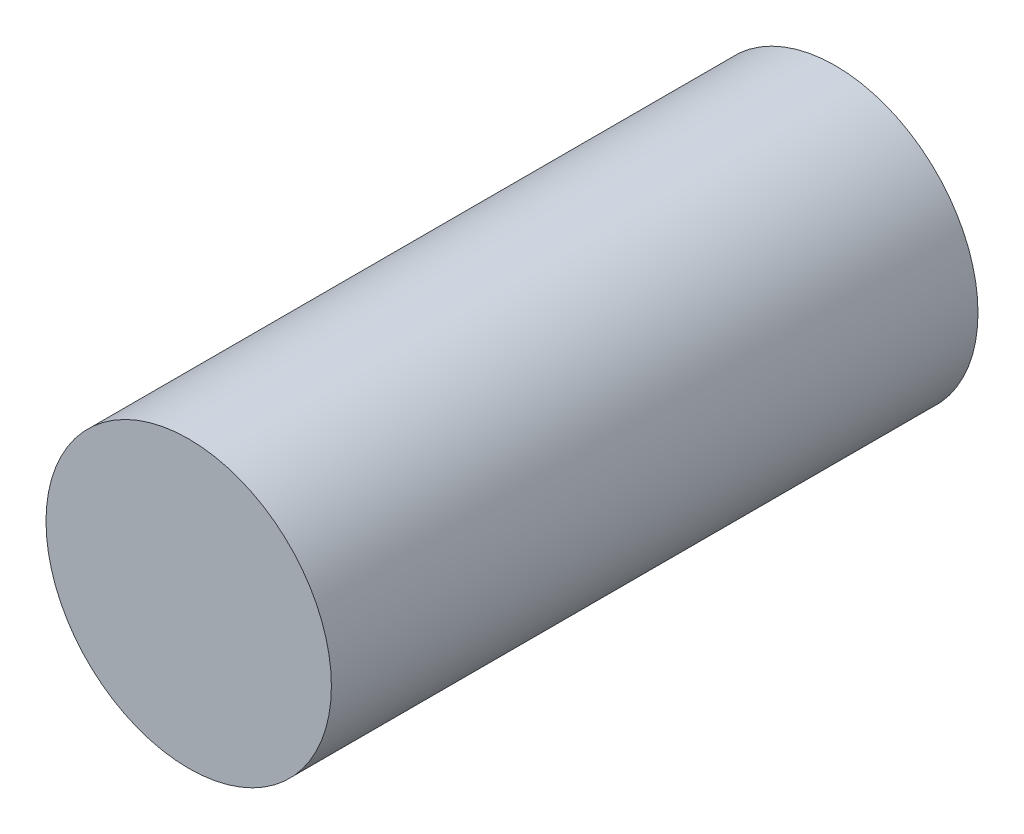
ISO-10303-21;
HEADER;
FILE_DESCRIPTION(('STEP AP214'),'2;1');
FILE_NAME('part.step','',(''),(''),'','','');
FILE_SCHEMA(('AUTOMOTIVE_DESIGN { 1 0 10303 214 1 1 1 1 }'));
ENDSEC;
DATA;
#1=APPLICATION_CONTEXT('core data for automotive mechanical design processes');
#2=APPLICATION_PROTOCOL_DEFINITION('international standard','automotive_design',2000,#1);
#3=PRODUCT_CONTEXT('',#1,'mechanical');
#4=PRODUCT('Part','Part','',(#3));
#5=PRODUCT_RELATED_PRODUCT_CATEGORY('part','',(#4));
#6=PRODUCT_DEFINITION_FORMATION('','',#4);
#7=PRODUCT_DEFINITION_CONTEXT('part definition',#1,'design');
#8=PRODUCT_DEFINITION('design','',#6,#7);
#9=PRODUCT_DEFINITION_SHAPE('','',#8);
#10=(LENGTH_UNIT() NAMED_UNIT(*) SI_UNIT(.MILLI.,.METRE.));
#11=(NAMED_UNIT(*) PLANE_ANGLE_UNIT() SI_UNIT($,.RADIAN.));
#12=(NAMED_UNIT(*) SI_UNIT($,.STERADIAN.) SOLID_ANGLE_UNIT());
#13=UNCERTAINTY_MEASURE_WITH_UNIT(LENGTH_MEASURE(1.E-05),#10,'distance_accuracy_value','');
#14=(GEOMETRIC_REPRESENTATION_CONTEXT(3) GLOBAL_UNCERTAINTY_ASSIGNED_CONTEXT((#13)) GLOBAL_UNIT_ASSIGNED_CONTEXT((#10,
#11,#12)) REPRESENTATION_CONTEXT('',''));
#15=CARTESIAN_POINT('',(0.,0.,0.));
#16=DIRECTION('',(0.,0.,1.));
#17=DIRECTION('',(1.,0.,0.));
#18=AXIS2_PLACEMENT_3D('',#15,#16,#17);
#19=CARTESIAN_POINT('',(0.,0.,21.75));
#20=DIRECTION('',(0.,0.,-1.));
#21=DIRECTION('',(-1.,0.,0.));
#22=AXIS2_PLACEMENT_3D('',#19,#20,#21);
#23=CYLINDRICAL_SURFACE('',#22,6.4);
#24=CARTESIAN_POINT('',(0.,0.,21.75));
#25=DIRECTION('',(0.,0.,1.));
#26=DIRECTION('',(1.,0.,0.));
#27=AXIS2_PLACEMENT_3D('',#24,#25,#26);
#28=CIRCLE('',#27,6.4);
#29=CARTESIAN_POINT('',(-6.4,0.,21.75));
#30=VERTEX_POINT('',#29);
#31=EDGE_CURVE('E10',#30,#30,#28,.T.);
#32=CARTESIAN_POINT('',(0.,0.,-7.25));
#33=DIRECTION('',(0.,0.,1.));
#34=DIRECTION('',(1.,0.,0.));
#35=AXIS2_PLACEMENT_3D('',#32,#33,#34);
#36=CIRCLE('',#35,6.4);
#37=CARTESIAN_POINT('',(-6.4,0.,-7.25));
#38=VERTEX_POINT('',#37);
#39=EDGE_CURVE('E36',#38,#38,#36,.T.);
#40=CARTESIAN_POINT('',(-6.4,0.,21.75));
#41=CARTESIAN_POINT('',(-6.4,0.,21.4479166666667));
#42=CARTESIAN_POINT('',(-6.4,0.,21.1458333333333));
#43=CARTESIAN_POINT('',(-6.4,0.,20.5416666666667));
#44=CARTESIAN_POINT('',(-6.4,0.,20.2395833333333));
#45=CARTESIAN_POINT('',(-6.4,0.,19.6354166666667));
#46=CARTESIAN_POINT('',(-6.4,0.,19.3333333333333));
#47=CARTESIAN_POINT('',(-6.4,0.,18.7291666666667));
#48=CARTESIAN_POINT('',(-6.4,0.,18.4270833333333));
#49=CARTESIAN_POINT('',(-6.4,0.,17.8229166666667));
#50=CARTESIAN_POINT('',(-6.4,0.,17.5208333333333));
#51=CARTESIAN_POINT('',(-6.4,0.,16.9166666666667));
#52=CARTESIAN_POINT('',(-6.4,0.,16.6145833333333));
#53=CARTESIAN_POINT('',(-6.4,0.,16.0104166666667));
#54=CARTESIAN_POINT('',(-6.4,0.,15.7083333333333));
#55=CARTESIAN_POINT('',(-6.4,0.,15.1041666666667));
#56=CARTESIAN_POINT('',(-6.4,0.,14.8020833333333));
#57=CARTESIAN_POINT('',(-6.4,0.,14.1979166666667));
#58=CARTESIAN_POINT('',(-6.4,0.,13.8958333333333));
#59=CARTESIAN_POINT('',(-6.4,0.,13.2916666666667));
#60=CARTESIAN_POINT('',(-6.4,0.,12.9895833333333));
#61=CARTESIAN_POINT('',(-6.4,0.,12.3854166666667));
#62=CARTESIAN_POINT('',(-6.4,0.,12.0833333333333));
#63=CARTESIAN_POINT('',(-6.4,0.,11.4791666666667));
#64=CARTESIAN_POINT('',(-6.4,0.,11.1770833333333));
#65=CARTESIAN_POINT('',(-6.4,0.,10.5729166666667));
#66=CARTESIAN_POINT('',(-6.4,0.,10.2708333333333));
#67=CARTESIAN_POINT('',(-6.4,0.,9.66666666666667));
#68=CARTESIAN_POINT('',(-6.4,0.,9.36458333333333));
#69=CARTESIAN_POINT('',(-6.4,0.,8.76041666666666));
#70=CARTESIAN_POINT('',(-6.4,0.,8.45833333333333));
#71=CARTESIAN_POINT('',(-6.4,0.,7.85416666666667));
#72=CARTESIAN_POINT('',(-6.4,0.,7.55208333333333));
#73=CARTESIAN_POINT('',(-6.4,0.,6.94791666666666));
#74=CARTESIAN_POINT('',(-6.4,0.,6.64583333333333));
#75=CARTESIAN_POINT('',(-6.4,0.,6.04166666666666));
#76=CARTESIAN_POINT('',(-6.4,0.,5.73958333333333));
#77=CARTESIAN_POINT('',(-6.4,0.,5.13541666666666));
#78=CARTESIAN_POINT('',(-6.4,0.,4.83333333333333));
#79=CARTESIAN_POINT('',(-6.4,0.,4.22916666666666));
#80=CARTESIAN_POINT('',(-6.4,0.,3.92708333333333));
#81=CARTESIAN_POINT('',(-6.4,0.,3.32291666666666));
#82=CARTESIAN_POINT('',(-6.4,0.,3.02083333333333));
#83=CARTESIAN_POINT('',(-6.4,0.,2.41666666666667));
#84=CARTESIAN_POINT('',(-6.4,0.,2.11458333333333));
#85=CARTESIAN_POINT('',(-6.4,0.,1.51041666666666));
#86=CARTESIAN_POINT('',(-6.4,0.,1.20833333333333));
#87=CARTESIAN_POINT('',(-6.4,0.,0.604166666666664));
#88=CARTESIAN_POINT('',(-6.4,0.,0.30208333333333));
#89=CARTESIAN_POINT('',(-6.4,0.,-0.302083333333337));
#90=CARTESIAN_POINT('',(-6.4,0.,-0.604166666666671));
#91=CARTESIAN_POINT('',(-6.4,0.,-1.20833333333334));
#92=CARTESIAN_POINT('',(-6.4,0.,-1.51041666666667));
#93=CARTESIAN_POINT('',(-6.4,0.,-2.11458333333334));
#94=CARTESIAN_POINT('',(-6.4,0.,-2.41666666666667));
#95=CARTESIAN_POINT('',(-6.4,0.,-3.02083333333334));
#96=CARTESIAN_POINT('',(-6.4,0.,-3.32291666666667));
#97=CARTESIAN_POINT('',(-6.4,0.,-3.92708333333334));
#98=CARTESIAN_POINT('',(-6.4,0.,-4.22916666666667));
#99=CARTESIAN_POINT('',(-6.4,0.,-4.83333333333334));
#100=CARTESIAN_POINT('',(-6.4,0.,-5.13541666666667));
#101=CARTESIAN_POINT('',(-6.4,0.,-5.73958333333333));
#102=CARTESIAN_POINT('',(-6.4,0.,-6.04166666666667));
#103=CARTESIAN_POINT('',(-6.4,0.,-6.64583333333334));
#104=CARTESIAN_POINT('',(-6.4,0.,-6.94791666666667));
#105=CARTESIAN_POINT('',(-6.4,0.,-7.25));
#106=B_SPLINE_CURVE_WITH_KNOTS('',3,(#40,#41,#42,#43,#44,#45,#46,#47,#48,#49,#50,#51,#52,#53,
#54,#55,#56,#57,#58,#59,#60,#61,#62,#63,#64,#65,#66,#67,#68,#69,#70,#71,#72,#73,#74,#75,#76,#77,
#78,#79,#80,#81,#82,#83,#84,#85,#86,#87,#88,#89,#90,#91,#92,#93,#94,#95,#96,#97,#98,#99,#100,
#101,#102,#103,#104,#105),.UNSPECIFIED.,.F.,.F.,(4,2,2,2,2,2,2,2,2,2,2,2,2,2,2,2,2,2,2,2,2,2,2,
2,2,2,2,2,2,2,2,2,4),(0.,0.906249999999997,1.8125,2.71875,3.625,4.53125,5.4375,6.34375,7.25,
8.15625,9.0625,9.96875,10.875,11.78125,12.6875,13.59375,14.5,15.40625,16.3125,17.21875,18.125,
19.03125,19.9375,20.84375,21.75,22.65625,23.5625,24.46875,25.375,26.28125,27.1875,28.09375,29.),.UNSPECIFIED.);
#107=EDGE_CURVE('BSEAM33',#30,#38,#106,.T.);
#108=ORIENTED_EDGE('',*,*,#31,.F.);
#109=ORIENTED_EDGE('',*,*,#39,.T.);
#110=ORIENTED_EDGE('',*,*,#107,.T.);
#111=ORIENTED_EDGE('',*,*,#107,.F.);
#112=EDGE_LOOP('',(#108,#110,#109,#111));
#113=FACE_BOUND('',#112,.T.);
#114=ADVANCED_FACE('F33',(#113),#23,.T.);
#115=CARTESIAN_POINT('',(0.,0.,21.75));
#116=DIRECTION('',(0.,0.,1.));
#117=DIRECTION('',(1.,0.,0.));
#118=AXIS2_PLACEMENT_3D('',#115,#116,#117);
#119=PLANE('',#118);
#120=ORIENTED_EDGE('',*,*,#31,.T.);
#121=EDGE_LOOP('',(#120));
#122=FACE_BOUND('',#121,.T.);
#123=ADVANCED_FACE('F48',(#122),#119,.T.);
#124=CARTESIAN_POINT('',(0.,0.,-7.25));
#125=DIRECTION('',(0.,0.,1.));
#126=DIRECTION('',(1.,0.,0.));
#127=AXIS2_PLACEMENT_3D('',#124,#125,#126);
#128=PLANE('',#127);
#129=ORIENTED_EDGE('',*,*,#39,.F.);
#130=EDGE_LOOP('',(#129));
#131=FACE_BOUND('',#130,.T.);
#132=ADVANCED_FACE('F46',(#131),#128,.F.);
#133=CLOSED_SHELL('',(#114,#123,#132));
#134=MANIFOLD_SOLID_BREP('B2',#133);
#135=ADVANCED_BREP_SHAPE_REPRESENTATION('',(#18,#134),#14);
#136=SHAPE_DEFINITION_REPRESENTATION(#9,#135);
ENDSEC;
END-ISO-10303-21;
